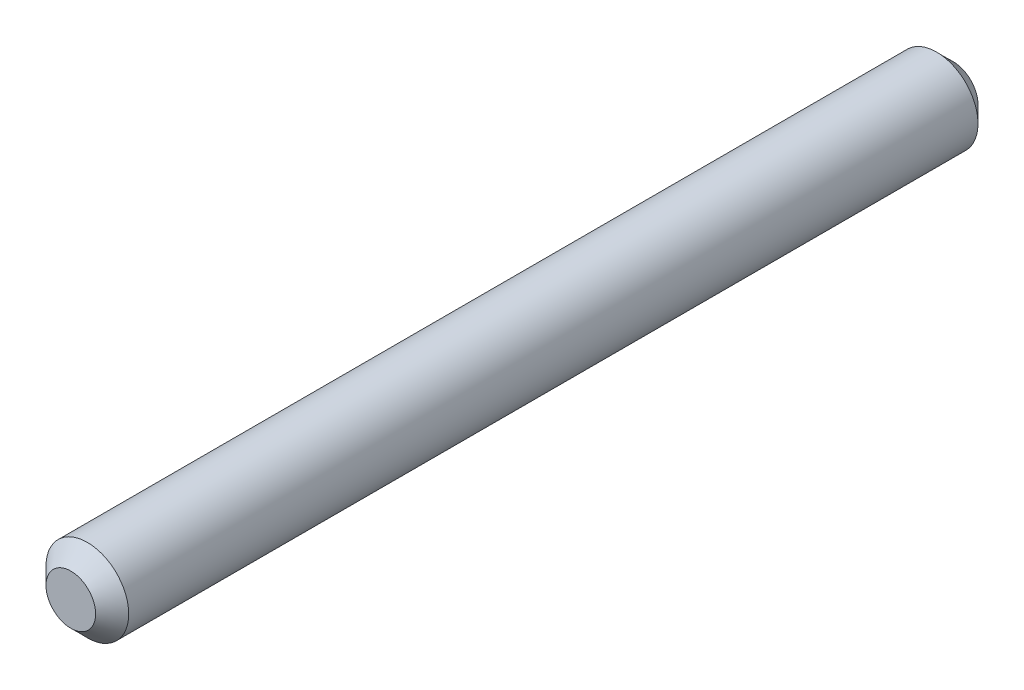
ISO-10303-21;
HEADER;
FILE_DESCRIPTION(('STEP AP214'),'2;1');
FILE_NAME('part.step','',(''),(''),'','','');
FILE_SCHEMA(('AUTOMOTIVE_DESIGN { 1 0 10303 214 1 1 1 1 }'));
ENDSEC;
DATA;
#1=APPLICATION_CONTEXT('core data for automotive mechanical design processes');
#2=APPLICATION_PROTOCOL_DEFINITION('international standard','automotive_design',2000,#1);
#3=PRODUCT_CONTEXT('',#1,'mechanical');
#4=PRODUCT('Part','Part','',(#3));
#5=PRODUCT_RELATED_PRODUCT_CATEGORY('part','',(#4));
#6=PRODUCT_DEFINITION_FORMATION('','',#4);
#7=PRODUCT_DEFINITION_CONTEXT('part definition',#1,'design');
#8=PRODUCT_DEFINITION('design','',#6,#7);
#9=PRODUCT_DEFINITION_SHAPE('','',#8);
#10=(LENGTH_UNIT() NAMED_UNIT(*) SI_UNIT(.MILLI.,.METRE.));
#11=(NAMED_UNIT(*) PLANE_ANGLE_UNIT() SI_UNIT($,.RADIAN.));
#12=(NAMED_UNIT(*) SI_UNIT($,.STERADIAN.) SOLID_ANGLE_UNIT());
#13=UNCERTAINTY_MEASURE_WITH_UNIT(LENGTH_MEASURE(1.E-05),#10,'distance_accuracy_value','');
#14=(GEOMETRIC_REPRESENTATION_CONTEXT(3) GLOBAL_UNCERTAINTY_ASSIGNED_CONTEXT((#13)) GLOBAL_UNIT_ASSIGNED_CONTEXT((#10,
#11,#12)) REPRESENTATION_CONTEXT('',''));
#15=CARTESIAN_POINT('',(0.,0.,0.));
#16=DIRECTION('',(0.,0.,1.));
#17=DIRECTION('',(1.,0.,0.));
#18=AXIS2_PLACEMENT_3D('',#15,#16,#17);
#19=CARTESIAN_POINT('',(0.,0.,0.));
#20=DIRECTION('',(0.,0.,1.));
#21=DIRECTION('',(1.,0.,0.));
#22=AXIS2_PLACEMENT_3D('',#19,#20,#21);
#23=PLANE('',#22);
#24=CARTESIAN_POINT('',(0.,0.,5.6843418860808E-11));
#25=DIRECTION('',(0.,0.,1.));
#26=DIRECTION('',(1.,0.,0.));
#27=AXIS2_PLACEMENT_3D('',#24,#25,#26);
#28=CIRCLE('',#27,0.449994188898016);
#29=CARTESIAN_POINT('',(0.449994188898016,0.,5.6843418860808E-11));
#30=VERTEX_POINT('',#29);
#31=EDGE_CURVE('E18',#30,#30,#28,.T.);
#32=ORIENTED_EDGE('',*,*,#31,.F.);
#33=EDGE_LOOP('',(#32));
#34=FACE_BOUND('',#33,.T.);
#35=ADVANCED_FACE('F15',(#34),#23,.F.);
#36=CARTESIAN_POINT('',(0.,0.,16.));
#37=DIRECTION('',(0.,0.,1.));
#38=DIRECTION('',(1.,0.,0.));
#39=AXIS2_PLACEMENT_3D('',#36,#37,#38);
#40=PLANE('',#39);
#41=CARTESIAN_POINT('',(0.,0.,15.9999999999627));
#42=DIRECTION('',(0.,0.,-1.));
#43=DIRECTION('',(-1.,0.,0.));
#44=AXIS2_PLACEMENT_3D('',#41,#42,#43);
#45=CIRCLE('',#44,0.449994188954859);
#46=CARTESIAN_POINT('',(-0.449994188954859,0.,15.9999999999627));
#47=VERTEX_POINT('',#46);
#48=EDGE_CURVE('E27',#47,#47,#45,.T.);
#49=ORIENTED_EDGE('',*,*,#48,.F.);
#50=EDGE_LOOP('',(#49));
#51=FACE_BOUND('',#50,.T.);
#52=ADVANCED_FACE('F38',(#51),#40,.T.);
#53=CARTESIAN_POINT('',(0.,0.,0.300009685304303));
#54=DIRECTION('',(0.,0.,1.));
#55=DIRECTION('',(1.,0.,0.));
#56=AXIS2_PLACEMENT_3D('',#53,#54,#55);
#57=CONICAL_SURFACE('',#56,0.749999999868578,0.785391706436049);
#58=CARTESIAN_POINT('',(0.,0.,0.300009685489086));
#59=DIRECTION('',(0.,0.,1.));
#60=DIRECTION('',(1.,0.,0.));
#61=AXIS2_PLACEMENT_3D('',#58,#59,#60);
#62=CIRCLE('',#61,0.75);
#63=CARTESIAN_POINT('',(0.75,0.,0.300009685489086));
#64=VERTEX_POINT('',#63);
#65=EDGE_CURVE('E22',#64,#64,#62,.T.);
#66=ORIENTED_EDGE('',*,*,#65,.F.);
#67=EDGE_LOOP('',(#66));
#68=FACE_BOUND('',#67,.T.);
#69=ORIENTED_EDGE('',*,*,#31,.T.);
#70=EDGE_LOOP('',(#69));
#71=FACE_BOUND('',#70,.T.);
#72=ADVANCED_FACE('F35',(#68,#71),#57,.T.);
#73=CARTESIAN_POINT('',(0.,0.,15.6999903148289));
#74=DIRECTION('',(0.,0.,-1.));
#75=DIRECTION('',(-1.,0.,0.));
#76=AXIS2_PLACEMENT_3D('',#73,#74,#75);
#77=CONICAL_SURFACE('',#76,0.749999999868578,0.785391706530785);
#78=CARTESIAN_POINT('',(0.,0.,15.6999903145873));
#79=DIRECTION('',(0.,0.,1.));
#80=DIRECTION('',(1.,0.,0.));
#81=AXIS2_PLACEMENT_3D('',#78,#79,#80);
#82=CIRCLE('',#81,0.75);
#83=CARTESIAN_POINT('',(0.75,0.,15.6999903145873));
#84=VERTEX_POINT('',#83);
#85=EDGE_CURVE('E10',#84,#84,#82,.F.);
#86=ORIENTED_EDGE('',*,*,#85,.F.);
#87=EDGE_LOOP('',(#86));
#88=FACE_BOUND('',#87,.T.);
#89=ORIENTED_EDGE('',*,*,#48,.T.);
#90=EDGE_LOOP('',(#89));
#91=FACE_BOUND('',#90,.T.);
#92=ADVANCED_FACE('F46',(#88,#91),#77,.T.);
#93=CARTESIAN_POINT('',(0.,0.,0.));
#94=DIRECTION('',(0.,0.,1.));
#95=DIRECTION('',(1.,0.,0.));
#96=AXIS2_PLACEMENT_3D('',#93,#94,#95);
#97=CYLINDRICAL_SURFACE('',#96,0.75);
#98=ORIENTED_EDGE('',*,*,#85,.T.);
#99=EDGE_LOOP('',(#98));
#100=FACE_BOUND('',#99,.T.);
#101=ORIENTED_EDGE('',*,*,#65,.T.);
#102=EDGE_LOOP('',(#101));
#103=FACE_BOUND('',#102,.T.);
#104=ADVANCED_FACE('F44',(#100,#103),#97,.T.);
#105=CLOSED_SHELL('',(#35,#52,#72,#92,#104));
#106=MANIFOLD_SOLID_BREP('B1',#105);
#107=ADVANCED_BREP_SHAPE_REPRESENTATION('',(#18,#106),#14);
#108=SHAPE_DEFINITION_REPRESENTATION(#9,#107);
ENDSEC;
END-ISO-10303-21;
